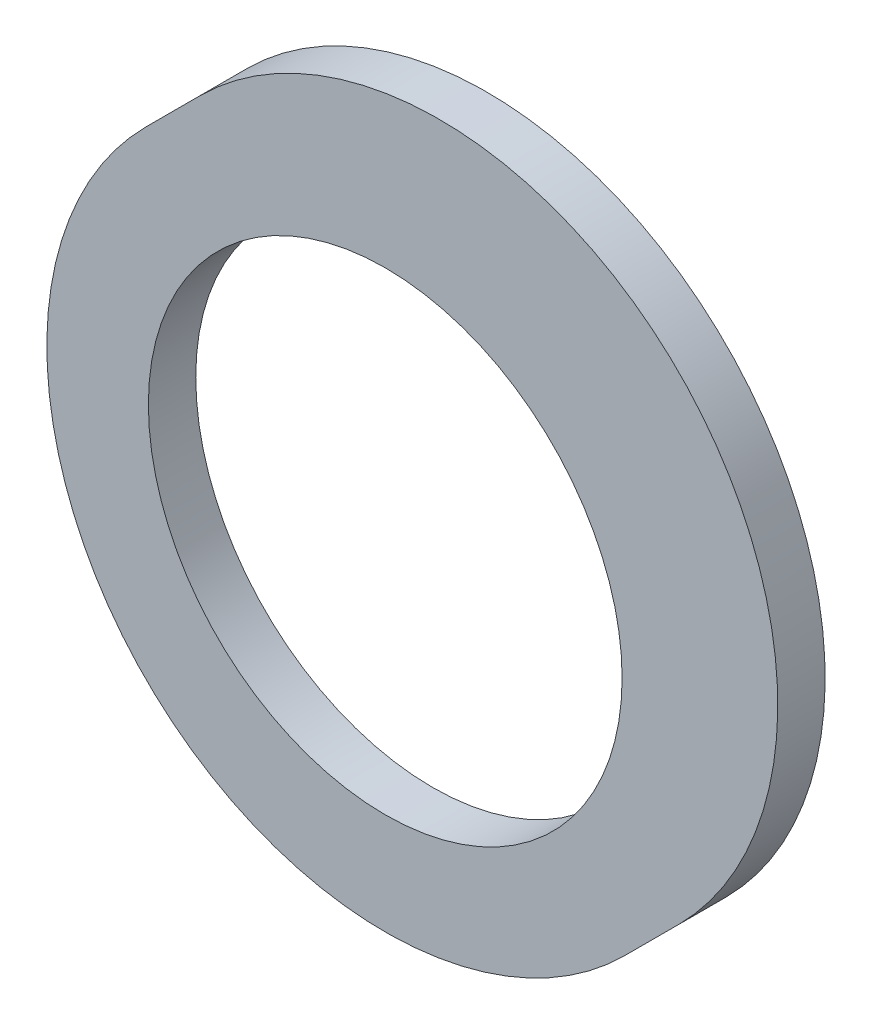
ISO-10303-21;
HEADER;
FILE_DESCRIPTION(('STEP AP214'),'2;1');
FILE_NAME('part.step','',(''),(''),'','','');
FILE_SCHEMA(('AUTOMOTIVE_DESIGN { 1 0 10303 214 1 1 1 1 }'));
ENDSEC;
DATA;
#1=APPLICATION_CONTEXT('core data for automotive mechanical design processes');
#2=APPLICATION_PROTOCOL_DEFINITION('international standard','automotive_design',2000,#1);
#3=PRODUCT_CONTEXT('',#1,'mechanical');
#4=PRODUCT('Part','Part','',(#3));
#5=PRODUCT_RELATED_PRODUCT_CATEGORY('part','',(#4));
#6=PRODUCT_DEFINITION_FORMATION('','',#4);
#7=PRODUCT_DEFINITION_CONTEXT('part definition',#1,'design');
#8=PRODUCT_DEFINITION('design','',#6,#7);
#9=PRODUCT_DEFINITION_SHAPE('','',#8);
#10=(LENGTH_UNIT() NAMED_UNIT(*) SI_UNIT(.MILLI.,.METRE.));
#11=(NAMED_UNIT(*) PLANE_ANGLE_UNIT() SI_UNIT($,.RADIAN.));
#12=(NAMED_UNIT(*) SI_UNIT($,.STERADIAN.) SOLID_ANGLE_UNIT());
#13=UNCERTAINTY_MEASURE_WITH_UNIT(LENGTH_MEASURE(1.E-05),#10,'distance_accuracy_value','');
#14=(GEOMETRIC_REPRESENTATION_CONTEXT(3) GLOBAL_UNCERTAINTY_ASSIGNED_CONTEXT((#13)) GLOBAL_UNIT_ASSIGNED_CONTEXT((#10,
#11,#12)) REPRESENTATION_CONTEXT('',''));
#15=CARTESIAN_POINT('',(0.,0.,0.));
#16=DIRECTION('',(0.,0.,1.));
#17=DIRECTION('',(1.,0.,0.));
#18=AXIS2_PLACEMENT_3D('',#15,#16,#17);
#19=CARTESIAN_POINT('',(125.27,-55.32,-0.045));
#20=DIRECTION('',(0.,0.,-1.));
#21=DIRECTION('',(0.,-1.,0.));
#22=AXIS2_PLACEMENT_3D('',#19,#20,#21);
#23=CYLINDRICAL_SURFACE('',#22,0.175);
#24=CARTESIAN_POINT('',(125.27,-55.32,-0.035));
#25=DIRECTION('',(0.,0.,-1.));
#26=DIRECTION('',(0.,-1.,0.));
#27=AXIS2_PLACEMENT_3D('',#24,#25,#26);
#28=CIRCLE('',#27,0.175);
#29=CARTESIAN_POINT('',(125.27,-55.495,-0.035));
#30=VERTEX_POINT('',#29);
#31=EDGE_CURVE('E86',#30,#30,#28,.T.);
#32=ORIENTED_EDGE('',*,*,#31,.T.);
#33=DIRECTION('',(0.,0.,1.));
#34=VECTOR('',#33,1.);
#35=CARTESIAN_POINT('',(125.27,-55.495,-0.045));
#36=LINE('',#35,#34);
#37=CARTESIAN_POINT('',(125.27,-55.495,0.));
#38=VERTEX_POINT('',#37);
#39=EDGE_CURVE('E11',#30,#38,#36,.T.);
#40=ORIENTED_EDGE('',*,*,#39,.T.);
#41=CARTESIAN_POINT('',(125.27,-55.32,0.));
#42=DIRECTION('',(0.,0.,-1.));
#43=DIRECTION('',(0.,-1.,0.));
#44=AXIS2_PLACEMENT_3D('',#41,#42,#43);
#45=CIRCLE('',#44,0.175);
#46=EDGE_CURVE('E25',#38,#38,#45,.T.);
#47=ORIENTED_EDGE('',*,*,#46,.F.);
#48=ORIENTED_EDGE('',*,*,#39,.F.);
#49=EDGE_LOOP('',(#32,#40,#47,#48));
#50=FACE_BOUND('',#49,.T.);
#51=ADVANCED_FACE('F17',(#50),#23,.F.);
#52=CARTESIAN_POINT('',(125.446776,-55.496776,-0.035));
#53=DIRECTION('',(-0.707106781186048,0.707106781187048,0.));
#54=DIRECTION('',(0.,0.,1.));
#55=AXIS2_PLACEMENT_3D('',#52,#53,#54);
#56=PLANE('',#55);
#57=DIRECTION('',(0.707106781187048,0.707106781186048,0.));
#58=VECTOR('',#57,1.);
#59=CARTESIAN_POINT('',(125.446776,-55.496776,-0.035));
#60=LINE('',#59,#58);
#61=CARTESIAN_POINT('',(125.446776,-55.496776,-0.035));
#62=VERTEX_POINT('',#61);
#63=CARTESIAN_POINT('',(125.486776,-55.456776,-0.035));
#64=VERTEX_POINT('',#63);
#65=EDGE_CURVE('E91',#62,#64,#60,.T.);
#66=ORIENTED_EDGE('',*,*,#65,.T.);
#67=DIRECTION('',(0.,0.,1.));
#68=VECTOR('',#67,1.);
#69=CARTESIAN_POINT('',(125.486776,-55.456776,-0.035));
#70=LINE('',#69,#68);
#71=CARTESIAN_POINT('',(125.486776,-55.456776,0.));
#72=VERTEX_POINT('',#71);
#73=EDGE_CURVE('E89',#64,#72,#70,.T.);
#74=ORIENTED_EDGE('',*,*,#73,.T.);
#75=DIRECTION('',(0.707106781187048,0.707106781186048,0.));
#76=VECTOR('',#75,1.);
#77=CARTESIAN_POINT('',(125.446776,-55.496776,0.));
#78=LINE('',#77,#76);
#79=CARTESIAN_POINT('',(125.446776,-55.496776,0.));
#80=VERTEX_POINT('',#79);
#81=EDGE_CURVE('E74',#80,#72,#78,.T.);
#82=ORIENTED_EDGE('',*,*,#81,.F.);
#83=DIRECTION('',(0.,0.,1.));
#84=VECTOR('',#83,1.);
#85=CARTESIAN_POINT('',(125.446776,-55.496776,-0.035));
#86=LINE('',#85,#84);
#87=EDGE_CURVE('E114',#62,#80,#86,.T.);
#88=ORIENTED_EDGE('',*,*,#87,.F.);
#89=EDGE_LOOP('',(#66,#74,#82,#88));
#90=FACE_BOUND('',#89,.T.);
#91=ADVANCED_FACE('F90',(#90),#56,.F.);
#92=CARTESIAN_POINT('',(125.133223,-55.103223,0.));
#93=DIRECTION('',(0.,0.,1.));
#94=DIRECTION('',(1.,0.,0.));
#95=AXIS2_PLACEMENT_3D('',#92,#93,#94);
#96=PLANE('',#95);
#97=ORIENTED_EDGE('',*,*,#46,.T.);
#98=EDGE_LOOP('',(#97));
#99=FACE_BOUND('',#98,.T.);
#100=DIRECTION('',(-0.707106781187048,-0.707106781186048,0.));
#101=VECTOR('',#100,1.);
#102=CARTESIAN_POINT('',(125.133223,-55.103223,0.));
#103=LINE('',#102,#101);
#104=CARTESIAN_POINT('',(125.133223,-55.103223,0.));
#105=VERTEX_POINT('',#104);
#106=CARTESIAN_POINT('',(125.093223,-55.143223,0.));
#107=VERTEX_POINT('',#106);
#108=EDGE_CURVE('E165',#105,#107,#103,.T.);
#109=ORIENTED_EDGE('',*,*,#108,.T.);
#110=CARTESIAN_POINT('',(125.2699995,-55.3199995,0.));
#111=DIRECTION('',(0.,0.,1.));
#112=DIRECTION('',(-0.707106781186548,0.707106781186548,0.));
#113=AXIS2_PLACEMENT_3D('',#110,#111,#112);
#114=CIRCLE('',#113,0.249999723809);
#115=EDGE_CURVE('E81',#107,#80,#114,.T.);
#116=ORIENTED_EDGE('',*,*,#115,.T.);
#117=ORIENTED_EDGE('',*,*,#81,.T.);
#118=CARTESIAN_POINT('',(125.3099995,-55.2799995,0.));
#119=DIRECTION('',(0.,0.,1.));
#120=DIRECTION('',(0.707106781186548,-0.707106781186548,0.));
#121=AXIS2_PLACEMENT_3D('',#118,#119,#120);
#122=CIRCLE('',#121,0.249999723809);
#123=EDGE_CURVE('E79',#72,#105,#122,.T.);
#124=ORIENTED_EDGE('',*,*,#123,.T.);
#125=EDGE_LOOP('',(#109,#116,#117,#124));
#126=FACE_BOUND('',#125,.T.);
#127=ADVANCED_FACE('F77',(#99,#126),#96,.T.);
#128=CARTESIAN_POINT('',(125.133223,-55.103223,-0.035));
#129=DIRECTION('',(0.,0.,1.));
#130=DIRECTION('',(1.,0.,0.));
#131=AXIS2_PLACEMENT_3D('',#128,#129,#130);
#132=PLANE('',#131);
#133=ORIENTED_EDGE('',*,*,#31,.F.);
#134=EDGE_LOOP('',(#133));
#135=FACE_BOUND('',#134,.T.);
#136=CARTESIAN_POINT('',(125.3099995,-55.2799995,-0.035));
#137=DIRECTION('',(0.,0.,1.));
#138=DIRECTION('',(0.707106781186548,-0.707106781186548,0.));
#139=AXIS2_PLACEMENT_3D('',#136,#137,#138);
#140=CIRCLE('',#139,0.249999723809);
#141=CARTESIAN_POINT('',(125.133223,-55.103223,-0.035));
#142=VERTEX_POINT('',#141);
#143=EDGE_CURVE('E102',#64,#142,#140,.T.);
#144=ORIENTED_EDGE('',*,*,#143,.F.);
#145=ORIENTED_EDGE('',*,*,#65,.F.);
#146=CARTESIAN_POINT('',(125.2699995,-55.3199995,-0.035));
#147=DIRECTION('',(0.,0.,1.));
#148=DIRECTION('',(-0.707106781186548,0.707106781186548,0.));
#149=AXIS2_PLACEMENT_3D('',#146,#147,#148);
#150=CIRCLE('',#149,0.249999723809);
#151=CARTESIAN_POINT('',(125.093223,-55.143223,-0.035));
#152=VERTEX_POINT('',#151);
#153=EDGE_CURVE('E95',#152,#62,#150,.T.);
#154=ORIENTED_EDGE('',*,*,#153,.F.);
#155=DIRECTION('',(-0.707106781187048,-0.707106781186048,0.));
#156=VECTOR('',#155,1.);
#157=CARTESIAN_POINT('',(125.133223,-55.103223,-0.035));
#158=LINE('',#157,#156);
#159=EDGE_CURVE('E156',#142,#152,#158,.T.);
#160=ORIENTED_EDGE('',*,*,#159,.F.);
#161=EDGE_LOOP('',(#144,#145,#154,#160));
#162=FACE_BOUND('',#161,.T.);
#163=ADVANCED_FACE('F136',(#135,#162),#132,.F.);
#164=CARTESIAN_POINT('',(125.2699995,-55.3199995,-0.035));
#165=DIRECTION('',(0.,0.,-1.));
#166=DIRECTION('',(-0.707106781186548,0.707106781186548,0.));
#167=AXIS2_PLACEMENT_3D('',#164,#165,#166);
#168=CYLINDRICAL_SURFACE('',#167,0.249999723809);
#169=ORIENTED_EDGE('',*,*,#153,.T.);
#170=ORIENTED_EDGE('',*,*,#87,.T.);
#171=ORIENTED_EDGE('',*,*,#115,.F.);
#172=DIRECTION('',(0.,0.,1.));
#173=VECTOR('',#172,1.);
#174=CARTESIAN_POINT('',(125.093223,-55.143223,-0.035));
#175=LINE('',#174,#173);
#176=EDGE_CURVE('E158',#152,#107,#175,.T.);
#177=ORIENTED_EDGE('',*,*,#176,.F.);
#178=EDGE_LOOP('',(#169,#170,#171,#177));
#179=FACE_BOUND('',#178,.T.);
#180=ADVANCED_FACE('F140',(#179),#168,.T.);
#181=CARTESIAN_POINT('',(125.3099995,-55.2799995,-0.035));
#182=DIRECTION('',(0.,0.,-1.));
#183=DIRECTION('',(0.707106781186548,-0.707106781186548,0.));
#184=AXIS2_PLACEMENT_3D('',#181,#182,#183);
#185=CYLINDRICAL_SURFACE('',#184,0.249999723809);
#186=ORIENTED_EDGE('',*,*,#143,.T.);
#187=DIRECTION('',(0.,0.,1.));
#188=VECTOR('',#187,1.);
#189=CARTESIAN_POINT('',(125.133223,-55.103223,-0.035));
#190=LINE('',#189,#188);
#191=EDGE_CURVE('E99',#142,#105,#190,.T.);
#192=ORIENTED_EDGE('',*,*,#191,.T.);
#193=ORIENTED_EDGE('',*,*,#123,.F.);
#194=ORIENTED_EDGE('',*,*,#73,.F.);
#195=EDGE_LOOP('',(#186,#192,#193,#194));
#196=FACE_BOUND('',#195,.T.);
#197=ADVANCED_FACE('F97',(#196),#185,.T.);
#198=CARTESIAN_POINT('',(125.133223,-55.103223,-0.035));
#199=DIRECTION('',(0.707106781186048,-0.707106781187048,0.));
#200=DIRECTION('',(0.,0.,-1.));
#201=AXIS2_PLACEMENT_3D('',#198,#199,#200);
#202=PLANE('',#201);
#203=ORIENTED_EDGE('',*,*,#159,.T.);
#204=ORIENTED_EDGE('',*,*,#176,.T.);
#205=ORIENTED_EDGE('',*,*,#108,.F.);
#206=ORIENTED_EDGE('',*,*,#191,.F.);
#207=EDGE_LOOP('',(#203,#204,#205,#206));
#208=FACE_BOUND('',#207,.T.);
#209=ADVANCED_FACE('F147',(#208),#202,.F.);
#210=CLOSED_SHELL('',(#51,#91,#127,#163,#180,#197,#209));
#211=MANIFOLD_SOLID_BREP('B1',#210);
#212=ADVANCED_BREP_SHAPE_REPRESENTATION('',(#18,#211),#14);
#213=SHAPE_DEFINITION_REPRESENTATION(#9,#212);
ENDSEC;
END-ISO-10303-21;
